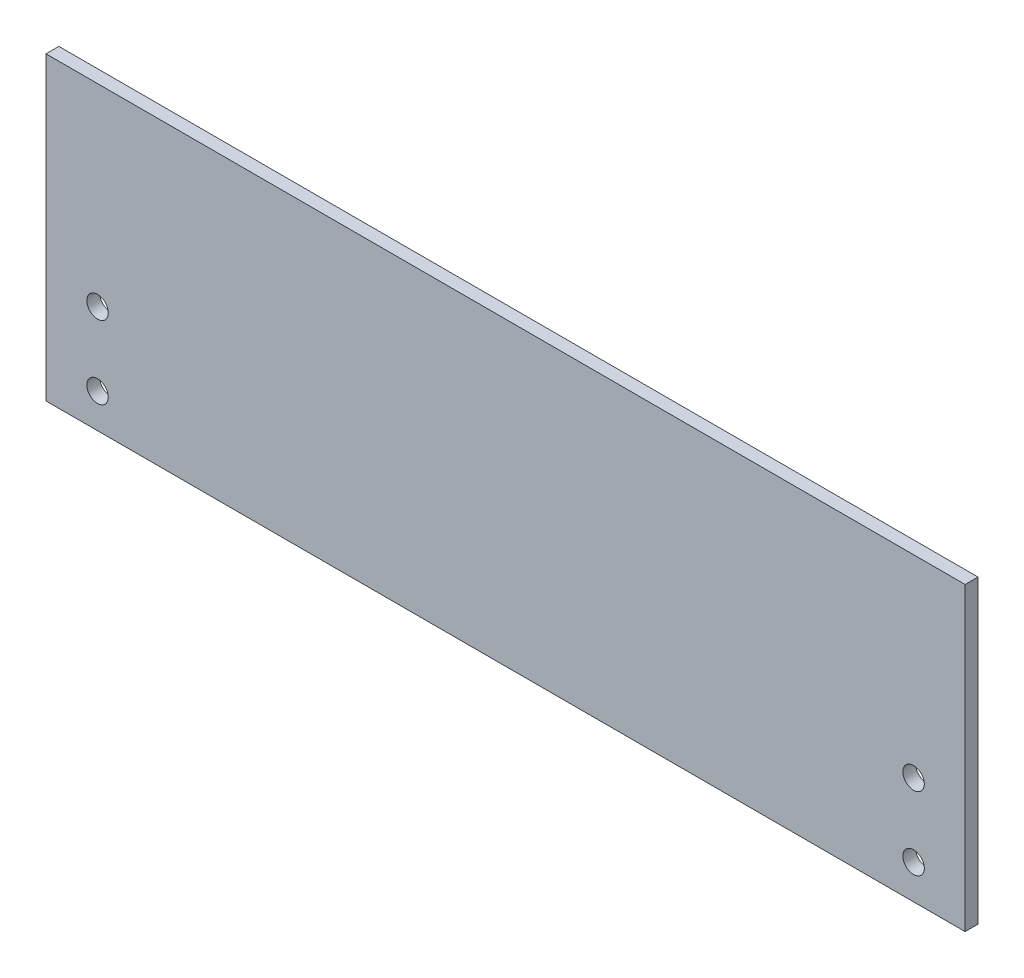
ISO-10303-21;
HEADER;
FILE_DESCRIPTION(('STEP AP214'),'2;1');
FILE_NAME('part.step','',(''),(''),'','','');
FILE_SCHEMA(('AUTOMOTIVE_DESIGN { 1 0 10303 214 1 1 1 1 }'));
ENDSEC;
DATA;
#1=APPLICATION_CONTEXT('core data for automotive mechanical design processes');
#2=APPLICATION_PROTOCOL_DEFINITION('international standard','automotive_design',2000,#1);
#3=PRODUCT_CONTEXT('',#1,'mechanical');
#4=PRODUCT('Part','Part','',(#3));
#5=PRODUCT_RELATED_PRODUCT_CATEGORY('part','',(#4));
#6=PRODUCT_DEFINITION_FORMATION('','',#4);
#7=PRODUCT_DEFINITION_CONTEXT('part definition',#1,'design');
#8=PRODUCT_DEFINITION('design','',#6,#7);
#9=PRODUCT_DEFINITION_SHAPE('','',#8);
#10=(LENGTH_UNIT() NAMED_UNIT(*) SI_UNIT(.MILLI.,.METRE.));
#11=(NAMED_UNIT(*) PLANE_ANGLE_UNIT() SI_UNIT($,.RADIAN.));
#12=(NAMED_UNIT(*) SI_UNIT($,.STERADIAN.) SOLID_ANGLE_UNIT());
#13=UNCERTAINTY_MEASURE_WITH_UNIT(LENGTH_MEASURE(1.E-05),#10,'distance_accuracy_value','');
#14=(GEOMETRIC_REPRESENTATION_CONTEXT(3) GLOBAL_UNCERTAINTY_ASSIGNED_CONTEXT((#13)) GLOBAL_UNIT_ASSIGNED_CONTEXT((#10,
#11,#12)) REPRESENTATION_CONTEXT('',''));
#15=CARTESIAN_POINT('',(0.,0.,0.));
#16=DIRECTION('',(0.,0.,1.));
#17=DIRECTION('',(1.,0.,0.));
#18=AXIS2_PLACEMENT_3D('',#15,#16,#17);
#19=CARTESIAN_POINT('',(0.,0.,3.));
#20=DIRECTION('',(0.,0.,1.));
#21=DIRECTION('',(1.,0.,0.));
#22=AXIS2_PLACEMENT_3D('',#19,#20,#21);
#23=PLANE('',#22);
#24=CARTESIAN_POINT('',(95.,-27.,3.));
#25=DIRECTION('',(0.,0.,1.));
#26=DIRECTION('',(-1.,0.,0.));
#27=AXIS2_PLACEMENT_3D('',#24,#25,#26);
#28=CIRCLE('',#27,2.50000000000001);
#29=CARTESIAN_POINT('',(92.5,-27.,3.));
#30=VERTEX_POINT('',#29);
#31=EDGE_CURVE('E125',#30,#30,#28,.T.);
#32=ORIENTED_EDGE('',*,*,#31,.F.);
#33=EDGE_LOOP('',(#32));
#34=FACE_BOUND('',#33,.T.);
#35=CARTESIAN_POINT('',(-95.,-9.99999999999999,3.));
#36=DIRECTION('',(0.,0.,1.));
#37=DIRECTION('',(1.,0.,0.));
#38=AXIS2_PLACEMENT_3D('',#35,#36,#37);
#39=CIRCLE('',#38,2.50000000000001);
#40=CARTESIAN_POINT('',(-92.5,-9.99999999999999,3.));
#41=VERTEX_POINT('',#40);
#42=EDGE_CURVE('E104',#41,#41,#39,.T.);
#43=ORIENTED_EDGE('',*,*,#42,.F.);
#44=EDGE_LOOP('',(#43));
#45=FACE_BOUND('',#44,.T.);
#46=DIRECTION('',(0.,1.,0.));
#47=VECTOR('',#46,1.);
#48=CARTESIAN_POINT('',(107.,35.,3.));
#49=LINE('',#48,#47);
#50=CARTESIAN_POINT('',(107.,-35.,3.));
#51=VERTEX_POINT('',#50);
#52=CARTESIAN_POINT('',(107.,35.,3.));
#53=VERTEX_POINT('',#52);
#54=EDGE_CURVE('E89',#51,#53,#49,.T.);
#55=ORIENTED_EDGE('',*,*,#54,.T.);
#56=DIRECTION('',(-1.,0.,0.));
#57=VECTOR('',#56,1.);
#58=CARTESIAN_POINT('',(-107.,35.,3.));
#59=LINE('',#58,#57);
#60=CARTESIAN_POINT('',(-107.,35.,3.));
#61=VERTEX_POINT('',#60);
#62=EDGE_CURVE('E84',#53,#61,#59,.T.);
#63=ORIENTED_EDGE('',*,*,#62,.T.);
#64=DIRECTION('',(0.,-1.,0.));
#65=VECTOR('',#64,1.);
#66=CARTESIAN_POINT('',(-107.,35.,3.));
#67=LINE('',#66,#65);
#68=CARTESIAN_POINT('',(-107.,-35.,3.));
#69=VERTEX_POINT('',#68);
#70=EDGE_CURVE('E87',#61,#69,#67,.T.);
#71=ORIENTED_EDGE('',*,*,#70,.T.);
#72=DIRECTION('',(1.,0.,0.));
#73=VECTOR('',#72,1.);
#74=CARTESIAN_POINT('',(-107.,-35.,3.));
#75=LINE('',#74,#73);
#76=EDGE_CURVE('E54',#69,#51,#75,.T.);
#77=ORIENTED_EDGE('',*,*,#76,.T.);
#78=EDGE_LOOP('',(#55,#63,#71,#77));
#79=FACE_BOUND('',#78,.T.);
#80=CARTESIAN_POINT('',(-95.,-27.,3.));
#81=DIRECTION('',(0.,0.,1.));
#82=DIRECTION('',(1.,0.,0.));
#83=AXIS2_PLACEMENT_3D('',#80,#81,#82);
#84=CIRCLE('',#83,2.50000000000001);
#85=CARTESIAN_POINT('',(-92.5,-27.,3.));
#86=VERTEX_POINT('',#85);
#87=EDGE_CURVE('E119',#86,#86,#84,.T.);
#88=ORIENTED_EDGE('',*,*,#87,.F.);
#89=EDGE_LOOP('',(#88));
#90=FACE_BOUND('',#89,.T.);
#91=CARTESIAN_POINT('',(95.,-9.99999999999999,3.));
#92=DIRECTION('',(0.,0.,1.));
#93=DIRECTION('',(-1.,0.,0.));
#94=AXIS2_PLACEMENT_3D('',#91,#92,#93);
#95=CIRCLE('',#94,2.50000000000001);
#96=CARTESIAN_POINT('',(92.5,-9.99999999999999,3.));
#97=VERTEX_POINT('',#96);
#98=EDGE_CURVE('E131',#97,#97,#95,.T.);
#99=ORIENTED_EDGE('',*,*,#98,.F.);
#100=EDGE_LOOP('',(#99));
#101=FACE_BOUND('',#100,.T.);
#102=ADVANCED_FACE('F37',(#34,#45,#79,#90,#101),#23,.T.);
#103=CARTESIAN_POINT('',(0.,0.,0.));
#104=DIRECTION('',(0.,0.,1.));
#105=DIRECTION('',(1.,0.,0.));
#106=AXIS2_PLACEMENT_3D('',#103,#104,#105);
#107=PLANE('',#106);
#108=DIRECTION('',(0.,1.,0.));
#109=VECTOR('',#108,1.);
#110=CARTESIAN_POINT('',(107.,35.,0.));
#111=LINE('',#110,#109);
#112=CARTESIAN_POINT('',(107.,-35.,0.));
#113=VERTEX_POINT('',#112);
#114=CARTESIAN_POINT('',(107.,35.,0.));
#115=VERTEX_POINT('',#114);
#116=EDGE_CURVE('E101',#113,#115,#111,.T.);
#117=ORIENTED_EDGE('',*,*,#116,.F.);
#118=DIRECTION('',(1.,0.,0.));
#119=VECTOR('',#118,1.);
#120=CARTESIAN_POINT('',(-107.,-35.,0.));
#121=LINE('',#120,#119);
#122=CARTESIAN_POINT('',(-107.,-35.,0.));
#123=VERTEX_POINT('',#122);
#124=EDGE_CURVE('E77',#123,#113,#121,.T.);
#125=ORIENTED_EDGE('',*,*,#124,.F.);
#126=DIRECTION('',(0.,-1.,0.));
#127=VECTOR('',#126,1.);
#128=CARTESIAN_POINT('',(-107.,35.,0.));
#129=LINE('',#128,#127);
#130=CARTESIAN_POINT('',(-107.,35.,0.));
#131=VERTEX_POINT('',#130);
#132=EDGE_CURVE('E71',#131,#123,#129,.T.);
#133=ORIENTED_EDGE('',*,*,#132,.F.);
#134=DIRECTION('',(-1.,0.,0.));
#135=VECTOR('',#134,1.);
#136=CARTESIAN_POINT('',(-107.,35.,0.));
#137=LINE('',#136,#135);
#138=EDGE_CURVE('E93',#115,#131,#137,.T.);
#139=ORIENTED_EDGE('',*,*,#138,.F.);
#140=EDGE_LOOP('',(#117,#125,#133,#139));
#141=FACE_BOUND('',#140,.T.);
#142=CARTESIAN_POINT('',(-95.,-9.99999999999999,0.));
#143=DIRECTION('',(0.,0.,1.));
#144=DIRECTION('',(1.,0.,0.));
#145=AXIS2_PLACEMENT_3D('',#142,#143,#144);
#146=CIRCLE('',#145,2.50000000000001);
#147=CARTESIAN_POINT('',(-92.5,-9.99999999999999,0.));
#148=VERTEX_POINT('',#147);
#149=EDGE_CURVE('E116',#148,#148,#146,.T.);
#150=ORIENTED_EDGE('',*,*,#149,.T.);
#151=EDGE_LOOP('',(#150));
#152=FACE_BOUND('',#151,.T.);
#153=CARTESIAN_POINT('',(-95.,-27.,0.));
#154=DIRECTION('',(0.,0.,1.));
#155=DIRECTION('',(1.,0.,0.));
#156=AXIS2_PLACEMENT_3D('',#153,#154,#155);
#157=CIRCLE('',#156,2.50000000000001);
#158=CARTESIAN_POINT('',(-92.5,-27.,0.));
#159=VERTEX_POINT('',#158);
#160=EDGE_CURVE('E122',#159,#159,#157,.T.);
#161=ORIENTED_EDGE('',*,*,#160,.T.);
#162=EDGE_LOOP('',(#161));
#163=FACE_BOUND('',#162,.T.);
#164=CARTESIAN_POINT('',(95.,-27.,0.));
#165=DIRECTION('',(0.,0.,1.));
#166=DIRECTION('',(-1.,0.,0.));
#167=AXIS2_PLACEMENT_3D('',#164,#165,#166);
#168=CIRCLE('',#167,2.50000000000001);
#169=CARTESIAN_POINT('',(92.5,-27.,0.));
#170=VERTEX_POINT('',#169);
#171=EDGE_CURVE('E128',#170,#170,#168,.T.);
#172=ORIENTED_EDGE('',*,*,#171,.T.);
#173=EDGE_LOOP('',(#172));
#174=FACE_BOUND('',#173,.T.);
#175=CARTESIAN_POINT('',(95.,-9.99999999999999,0.));
#176=DIRECTION('',(0.,0.,1.));
#177=DIRECTION('',(-1.,0.,0.));
#178=AXIS2_PLACEMENT_3D('',#175,#176,#177);
#179=CIRCLE('',#178,2.50000000000001);
#180=CARTESIAN_POINT('',(92.5,-9.99999999999999,0.));
#181=VERTEX_POINT('',#180);
#182=EDGE_CURVE('E134',#181,#181,#179,.T.);
#183=ORIENTED_EDGE('',*,*,#182,.T.);
#184=EDGE_LOOP('',(#183));
#185=FACE_BOUND('',#184,.T.);
#186=ADVANCED_FACE('F112',(#141,#152,#163,#174,#185),#107,.F.);
#187=CARTESIAN_POINT('',(107.,35.,3.));
#188=DIRECTION('',(-1.,0.,0.));
#189=DIRECTION('',(0.,-1.,0.));
#190=AXIS2_PLACEMENT_3D('',#187,#188,#189);
#191=PLANE('',#190);
#192=ORIENTED_EDGE('',*,*,#116,.T.);
#193=DIRECTION('',(0.,0.,-1.));
#194=VECTOR('',#193,1.);
#195=CARTESIAN_POINT('',(107.,35.,3.));
#196=LINE('',#195,#194);
#197=EDGE_CURVE('E11',#53,#115,#196,.T.);
#198=ORIENTED_EDGE('',*,*,#197,.F.);
#199=ORIENTED_EDGE('',*,*,#54,.F.);
#200=DIRECTION('',(0.,0.,-1.));
#201=VECTOR('',#200,1.);
#202=CARTESIAN_POINT('',(107.,-35.,3.));
#203=LINE('',#202,#201);
#204=EDGE_CURVE('E97',#51,#113,#203,.T.);
#205=ORIENTED_EDGE('',*,*,#204,.T.);
#206=EDGE_LOOP('',(#192,#198,#199,#205));
#207=FACE_BOUND('',#206,.T.);
#208=ADVANCED_FACE('F39',(#207),#191,.F.);
#209=CARTESIAN_POINT('',(-107.,35.,3.));
#210=DIRECTION('',(0.,-1.,0.));
#211=DIRECTION('',(0.,0.,-1.));
#212=AXIS2_PLACEMENT_3D('',#209,#210,#211);
#213=PLANE('',#212);
#214=ORIENTED_EDGE('',*,*,#138,.T.);
#215=DIRECTION('',(0.,0.,-1.));
#216=VECTOR('',#215,1.);
#217=CARTESIAN_POINT('',(-107.,35.,3.));
#218=LINE('',#217,#216);
#219=EDGE_CURVE('E46',#61,#131,#218,.T.);
#220=ORIENTED_EDGE('',*,*,#219,.F.);
#221=ORIENTED_EDGE('',*,*,#62,.F.);
#222=ORIENTED_EDGE('',*,*,#197,.T.);
#223=EDGE_LOOP('',(#214,#220,#221,#222));
#224=FACE_BOUND('',#223,.T.);
#225=ADVANCED_FACE('F92',(#224),#213,.F.);
#226=CARTESIAN_POINT('',(-107.,35.,3.));
#227=DIRECTION('',(1.,0.,0.));
#228=DIRECTION('',(0.,0.,-1.));
#229=AXIS2_PLACEMENT_3D('',#226,#227,#228);
#230=PLANE('',#229);
#231=ORIENTED_EDGE('',*,*,#132,.T.);
#232=DIRECTION('',(0.,0.,-1.));
#233=VECTOR('',#232,1.);
#234=CARTESIAN_POINT('',(-107.,-35.,3.));
#235=LINE('',#234,#233);
#236=EDGE_CURVE('E94',#69,#123,#235,.T.);
#237=ORIENTED_EDGE('',*,*,#236,.F.);
#238=ORIENTED_EDGE('',*,*,#70,.F.);
#239=ORIENTED_EDGE('',*,*,#219,.T.);
#240=EDGE_LOOP('',(#231,#237,#238,#239));
#241=FACE_BOUND('',#240,.T.);
#242=ADVANCED_FACE('F95',(#241),#230,.F.);
#243=CARTESIAN_POINT('',(-107.,-35.,3.));
#244=DIRECTION('',(0.,1.,0.));
#245=DIRECTION('',(0.,0.,1.));
#246=AXIS2_PLACEMENT_3D('',#243,#244,#245);
#247=PLANE('',#246);
#248=ORIENTED_EDGE('',*,*,#124,.T.);
#249=ORIENTED_EDGE('',*,*,#204,.F.);
#250=ORIENTED_EDGE('',*,*,#76,.F.);
#251=ORIENTED_EDGE('',*,*,#236,.T.);
#252=EDGE_LOOP('',(#248,#249,#250,#251));
#253=FACE_BOUND('',#252,.T.);
#254=ADVANCED_FACE('F109',(#253),#247,.F.);
#255=CARTESIAN_POINT('',(-95.,-9.99999999999999,3.));
#256=DIRECTION('',(0.,0.,-1.));
#257=DIRECTION('',(-1.,0.,0.));
#258=AXIS2_PLACEMENT_3D('',#255,#256,#257);
#259=CYLINDRICAL_SURFACE('',#258,2.50000000000001);
#260=ORIENTED_EDGE('',*,*,#42,.T.);
#261=EDGE_LOOP('',(#260));
#262=FACE_BOUND('',#261,.T.);
#263=ORIENTED_EDGE('',*,*,#149,.F.);
#264=EDGE_LOOP('',(#263));
#265=FACE_BOUND('',#264,.T.);
#266=ADVANCED_FACE('F153',(#262,#265),#259,.F.);
#267=CARTESIAN_POINT('',(-95.,-27.,3.));
#268=DIRECTION('',(0.,0.,-1.));
#269=DIRECTION('',(-1.,0.,0.));
#270=AXIS2_PLACEMENT_3D('',#267,#268,#269);
#271=CYLINDRICAL_SURFACE('',#270,2.50000000000001);
#272=ORIENTED_EDGE('',*,*,#87,.T.);
#273=EDGE_LOOP('',(#272));
#274=FACE_BOUND('',#273,.T.);
#275=ORIENTED_EDGE('',*,*,#160,.F.);
#276=EDGE_LOOP('',(#275));
#277=FACE_BOUND('',#276,.T.);
#278=ADVANCED_FACE('F207',(#274,#277),#271,.F.);
#279=CARTESIAN_POINT('',(95.,-27.,3.));
#280=DIRECTION('',(0.,0.,-1.));
#281=DIRECTION('',(-1.,0.,0.));
#282=AXIS2_PLACEMENT_3D('',#279,#280,#281);
#283=CYLINDRICAL_SURFACE('',#282,2.50000000000001);
#284=ORIENTED_EDGE('',*,*,#31,.T.);
#285=EDGE_LOOP('',(#284));
#286=FACE_BOUND('',#285,.T.);
#287=ORIENTED_EDGE('',*,*,#171,.F.);
#288=EDGE_LOOP('',(#287));
#289=FACE_BOUND('',#288,.T.);
#290=ADVANCED_FACE('F216',(#286,#289),#283,.F.);
#291=CARTESIAN_POINT('',(95.,-9.99999999999999,3.));
#292=DIRECTION('',(0.,0.,-1.));
#293=DIRECTION('',(-1.,0.,0.));
#294=AXIS2_PLACEMENT_3D('',#291,#292,#293);
#295=CYLINDRICAL_SURFACE('',#294,2.50000000000001);
#296=ORIENTED_EDGE('',*,*,#98,.T.);
#297=EDGE_LOOP('',(#296));
#298=FACE_BOUND('',#297,.T.);
#299=ORIENTED_EDGE('',*,*,#182,.F.);
#300=EDGE_LOOP('',(#299));
#301=FACE_BOUND('',#300,.T.);
#302=ADVANCED_FACE('F140',(#298,#301),#295,.F.);
#303=CLOSED_SHELL('',(#102,#186,#208,#225,#242,#254,#266,#278,#290,#302));
#304=MANIFOLD_SOLID_BREP('B2',#303);
#305=ADVANCED_BREP_SHAPE_REPRESENTATION('',(#18,#304),#14);
#306=SHAPE_DEFINITION_REPRESENTATION(#9,#305);
ENDSEC;
END-ISO-10303-21;
